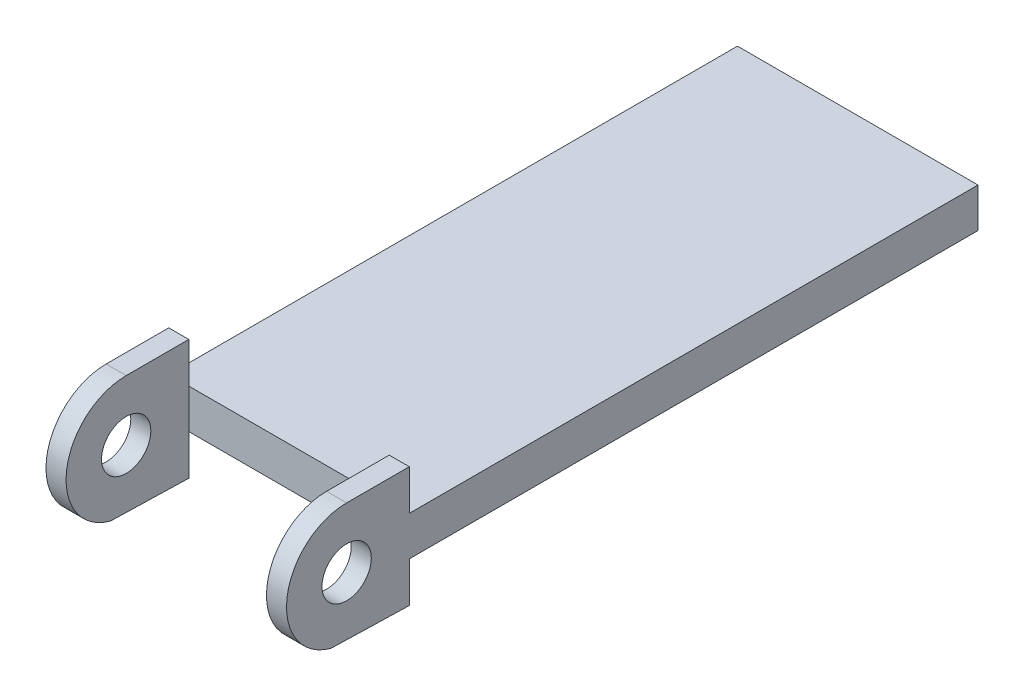
ISO-10303-21;
HEADER;
FILE_DESCRIPTION(('STEP AP214'),'2;1');
FILE_NAME('part.step','',(''),(''),'','','');
FILE_SCHEMA(('AUTOMOTIVE_DESIGN { 1 0 10303 214 1 1 1 1 }'));
ENDSEC;
DATA;
#1=APPLICATION_CONTEXT('core data for automotive mechanical design processes');
#2=APPLICATION_PROTOCOL_DEFINITION('international standard','automotive_design',2000,#1);
#3=PRODUCT_CONTEXT('',#1,'mechanical');
#4=PRODUCT('Part','Part','',(#3));
#5=PRODUCT_RELATED_PRODUCT_CATEGORY('part','',(#4));
#6=PRODUCT_DEFINITION_FORMATION('','',#4);
#7=PRODUCT_DEFINITION_CONTEXT('part definition',#1,'design');
#8=PRODUCT_DEFINITION('design','',#6,#7);
#9=PRODUCT_DEFINITION_SHAPE('','',#8);
#10=(LENGTH_UNIT() NAMED_UNIT(*) SI_UNIT(.MILLI.,.METRE.));
#11=(NAMED_UNIT(*) PLANE_ANGLE_UNIT() SI_UNIT($,.RADIAN.));
#12=(NAMED_UNIT(*) SI_UNIT($,.STERADIAN.) SOLID_ANGLE_UNIT());
#13=UNCERTAINTY_MEASURE_WITH_UNIT(LENGTH_MEASURE(1.E-05),#10,'distance_accuracy_value','');
#14=(GEOMETRIC_REPRESENTATION_CONTEXT(3) GLOBAL_UNCERTAINTY_ASSIGNED_CONTEXT((#13)) GLOBAL_UNIT_ASSIGNED_CONTEXT((#10,
#11,#12)) REPRESENTATION_CONTEXT('',''));
#15=CARTESIAN_POINT('',(0.,0.,0.));
#16=DIRECTION('',(0.,0.,1.));
#17=DIRECTION('',(1.,0.,0.));
#18=AXIS2_PLACEMENT_3D('',#15,#16,#17);
#19=CARTESIAN_POINT('',(-14.8073113249384,0.,13.462));
#20=DIRECTION('',(0.,0.,1.));
#21=DIRECTION('',(1.,0.,0.));
#22=AXIS2_PLACEMENT_3D('',#19,#20,#21);
#23=PLANE('',#22);
#24=DIRECTION('',(1.,0.,0.));
#25=VECTOR('',#24,1.);
#26=CARTESIAN_POINT('',(-14.8073113249384,-2.048,13.462));
#27=LINE('',#26,#25);
#28=CARTESIAN_POINT('',(5.08,-2.048,13.462));
#29=VERTEX_POINT('',#28);
#30=CARTESIAN_POINT('',(6.096,-2.048,13.462));
#31=VERTEX_POINT('',#30);
#32=EDGE_CURVE('E247',#29,#31,#27,.T.);
#33=ORIENTED_EDGE('',*,*,#32,.F.);
#34=DIRECTION('',(0.,1.,0.));
#35=VECTOR('',#34,1.);
#36=CARTESIAN_POINT('',(5.08,-2.048,13.462));
#37=LINE('',#36,#35);
#38=CARTESIAN_POINT('',(5.08,0.,13.462));
#39=VERTEX_POINT('',#38);
#40=EDGE_CURVE('E106',#29,#39,#37,.T.);
#41=ORIENTED_EDGE('',*,*,#40,.T.);
#42=DIRECTION('',(1.,0.,0.));
#43=VECTOR('',#42,1.);
#44=CARTESIAN_POINT('',(0.,0.,13.462));
#45=LINE('',#44,#43);
#46=CARTESIAN_POINT('',(6.096,0.,13.462));
#47=VERTEX_POINT('',#46);
#48=EDGE_CURVE('E44',#39,#47,#45,.T.);
#49=ORIENTED_EDGE('',*,*,#48,.T.);
#50=DIRECTION('',(0.,-1.,0.));
#51=VECTOR('',#50,1.);
#52=CARTESIAN_POINT('',(6.096,0.,13.462));
#53=LINE('',#52,#51);
#54=EDGE_CURVE('E190',#47,#31,#53,.T.);
#55=ORIENTED_EDGE('',*,*,#54,.T.);
#56=EDGE_LOOP('',(#33,#41,#49,#55));
#57=FACE_BOUND('',#56,.T.);
#58=ADVANCED_FACE('F35',(#57),#23,.F.);
#59=CARTESIAN_POINT('',(-14.8073113249384,1.,16.637));
#60=DIRECTION('',(1.,0.,0.));
#61=DIRECTION('',(0.,0.,-1.));
#62=AXIS2_PLACEMENT_3D('',#59,#60,#61);
#63=CYLINDRICAL_SURFACE('',#62,3.048);
#64=CARTESIAN_POINT('',(5.08,1.,16.637));
#65=DIRECTION('',(1.,0.,0.));
#66=DIRECTION('',(0.,0.,-1.));
#67=AXIS2_PLACEMENT_3D('',#64,#65,#66);
#68=CIRCLE('',#67,3.048);
#69=CARTESIAN_POINT('',(5.08,-1.94162891416641,17.4352000572163));
#70=VERTEX_POINT('',#69);
#71=CARTESIAN_POINT('',(5.08,4.048,16.637));
#72=VERTEX_POINT('',#71);
#73=EDGE_CURVE('E279',#70,#72,#68,.F.);
#74=ORIENTED_EDGE('',*,*,#73,.F.);
#75=DIRECTION('',(1.,0.,0.));
#76=VECTOR('',#75,1.);
#77=CARTESIAN_POINT('',(-14.8073113249384,-1.94162891416641,17.4352000572163));
#78=LINE('',#77,#76);
#79=CARTESIAN_POINT('',(6.096,-1.94162891416641,17.4352000572163));
#80=VERTEX_POINT('',#79);
#81=EDGE_CURVE('E171',#70,#80,#78,.T.);
#82=ORIENTED_EDGE('',*,*,#81,.T.);
#83=CARTESIAN_POINT('',(6.096,1.,16.637));
#84=DIRECTION('',(1.,0.,0.));
#85=DIRECTION('',(0.,0.,-1.));
#86=AXIS2_PLACEMENT_3D('',#83,#84,#85);
#87=CIRCLE('',#86,3.048);
#88=CARTESIAN_POINT('',(6.096,4.048,16.637));
#89=VERTEX_POINT('',#88);
#90=EDGE_CURVE('E256',#89,#80,#87,.T.);
#91=ORIENTED_EDGE('',*,*,#90,.F.);
#92=DIRECTION('',(1.,0.,0.));
#93=VECTOR('',#92,1.);
#94=CARTESIAN_POINT('',(-14.8073113249384,4.048,16.637));
#95=LINE('',#94,#93);
#96=EDGE_CURVE('E172',#72,#89,#95,.T.);
#97=ORIENTED_EDGE('',*,*,#96,.F.);
#98=EDGE_LOOP('',(#74,#82,#91,#97));
#99=FACE_BOUND('',#98,.T.);
#100=ADVANCED_FACE('F305',(#99),#63,.T.);
#101=CARTESIAN_POINT('',(-14.8073113249384,-2.40668162493172,0.0644320280915053));
#102=DIRECTION('',(0.,0.999641818673696,-0.0267625551610102));
#103=DIRECTION('',(0.,0.0267625551610102,0.999641818673696));
#104=AXIS2_PLACEMENT_3D('',#101,#102,#103);
#105=PLANE('',#104);
#106=ORIENTED_EDGE('',*,*,#81,.F.);
#107=DIRECTION('',(0.,-0.0267625551610102,-0.999641818673696));
#108=VECTOR('',#107,1.);
#109=CARTESIAN_POINT('',(5.08,-2.40668162493172,0.0644320280915053));
#110=LINE('',#109,#108);
#111=EDGE_CURVE('E281',#70,#29,#110,.T.);
#112=ORIENTED_EDGE('',*,*,#111,.T.);
#113=ORIENTED_EDGE('',*,*,#32,.T.);
#114=DIRECTION('',(0.,0.0267625551610102,0.999641818673696));
#115=VECTOR('',#114,1.);
#116=CARTESIAN_POINT('',(6.096,-2.40668162493172,0.0644320280915025));
#117=LINE('',#116,#115);
#118=EDGE_CURVE('E253',#31,#80,#117,.T.);
#119=ORIENTED_EDGE('',*,*,#118,.T.);
#120=EDGE_LOOP('',(#106,#112,#113,#119));
#121=FACE_BOUND('',#120,.T.);
#122=ADVANCED_FACE('F312',(#121),#105,.F.);
#123=DIRECTION('',(1.,0.,0.));
#124=VECTOR('',#123,1.);
#125=CARTESIAN_POINT('',(0.,2.,13.462));
#126=LINE('',#125,#124);
#127=CARTESIAN_POINT('',(5.08,2.,13.462));
#128=VERTEX_POINT('',#127);
#129=CARTESIAN_POINT('',(6.096,2.,13.462));
#130=VERTEX_POINT('',#129);
#131=EDGE_CURVE('E182',#128,#130,#126,.T.);
#132=ORIENTED_EDGE('',*,*,#131,.F.);
#133=CARTESIAN_POINT('',(5.08,4.048,13.462));
#134=VERTEX_POINT('',#133);
#135=EDGE_CURVE('E115',#128,#134,#37,.T.);
#136=ORIENTED_EDGE('',*,*,#135,.T.);
#137=DIRECTION('',(1.,0.,0.));
#138=VECTOR('',#137,1.);
#139=CARTESIAN_POINT('',(-14.8073113249384,4.048,13.462));
#140=LINE('',#139,#138);
#141=CARTESIAN_POINT('',(6.096,4.048,13.462));
#142=VERTEX_POINT('',#141);
#143=EDGE_CURVE('E246',#134,#142,#140,.T.);
#144=ORIENTED_EDGE('',*,*,#143,.T.);
#145=EDGE_CURVE('E177',#142,#130,#53,.T.);
#146=ORIENTED_EDGE('',*,*,#145,.T.);
#147=EDGE_LOOP('',(#132,#136,#144,#146));
#148=FACE_BOUND('',#147,.T.);
#149=ADVANCED_FACE('F307',(#148),#23,.F.);
#150=CARTESIAN_POINT('',(-14.8073113249384,4.04799999999999,0.));
#151=DIRECTION('',(0.,-1.,0.));
#152=DIRECTION('',(0.,0.,-1.));
#153=AXIS2_PLACEMENT_3D('',#150,#151,#152);
#154=PLANE('',#153);
#155=ORIENTED_EDGE('',*,*,#143,.F.);
#156=DIRECTION('',(0.,0.,-1.));
#157=VECTOR('',#156,1.);
#158=CARTESIAN_POINT('',(5.08,4.048,19.685));
#159=LINE('',#158,#157);
#160=EDGE_CURVE('E138',#72,#134,#159,.T.);
#161=ORIENTED_EDGE('',*,*,#160,.F.);
#162=ORIENTED_EDGE('',*,*,#96,.T.);
#163=DIRECTION('',(0.,0.,-1.));
#164=VECTOR('',#163,1.);
#165=CARTESIAN_POINT('',(6.096,4.04799999999999,0.));
#166=LINE('',#165,#164);
#167=EDGE_CURVE('E259',#89,#142,#166,.T.);
#168=ORIENTED_EDGE('',*,*,#167,.T.);
#169=EDGE_LOOP('',(#155,#161,#162,#168));
#170=FACE_BOUND('',#169,.T.);
#171=ADVANCED_FACE('F318',(#170),#154,.F.);
#172=CARTESIAN_POINT('',(-6.096,1.,16.637));
#173=DIRECTION('',(1.,0.,0.));
#174=DIRECTION('',(0.,0.,-1.));
#175=AXIS2_PLACEMENT_3D('',#172,#173,#174);
#176=CYLINDRICAL_SURFACE('',#175,1.25);
#177=CARTESIAN_POINT('',(5.08,1.,16.637));
#178=DIRECTION('',(1.,0.,0.));
#179=DIRECTION('',(0.,0.,-1.));
#180=AXIS2_PLACEMENT_3D('',#177,#178,#179);
#181=CIRCLE('',#180,1.25);
#182=CARTESIAN_POINT('',(5.08,1.,15.387));
#183=VERTEX_POINT('',#182);
#184=EDGE_CURVE('E39',#183,#183,#181,.F.);
#185=ORIENTED_EDGE('',*,*,#184,.T.);
#186=EDGE_LOOP('',(#185));
#187=FACE_BOUND('',#186,.T.);
#188=CARTESIAN_POINT('',(6.096,1.,16.637));
#189=DIRECTION('',(1.,0.,0.));
#190=DIRECTION('',(0.,0.,-1.));
#191=AXIS2_PLACEMENT_3D('',#188,#189,#190);
#192=CIRCLE('',#191,1.25);
#193=CARTESIAN_POINT('',(6.096,1.,15.387));
#194=VERTEX_POINT('',#193);
#195=EDGE_CURVE('E270',#194,#194,#192,.T.);
#196=ORIENTED_EDGE('',*,*,#195,.T.);
#197=EDGE_LOOP('',(#196));
#198=FACE_BOUND('',#197,.T.);
#199=ADVANCED_FACE('F289',(#187,#198),#176,.F.);
#200=CARTESIAN_POINT('',(0.,2.,0.));
#201=DIRECTION('',(0.,1.,0.));
#202=DIRECTION('',(0.,0.,1.));
#203=AXIS2_PLACEMENT_3D('',#200,#201,#202);
#204=PLANE('',#203);
#205=DIRECTION('',(0.,0.,1.));
#206=VECTOR('',#205,1.);
#207=CARTESIAN_POINT('',(-6.096,2.,-15.367));
#208=LINE('',#207,#206);
#209=CARTESIAN_POINT('',(-6.096,2.,-15.367));
#210=VERTEX_POINT('',#209);
#211=CARTESIAN_POINT('',(-6.096,2.,13.462));
#212=VERTEX_POINT('',#211);
#213=EDGE_CURVE('E93',#210,#212,#208,.T.);
#214=ORIENTED_EDGE('',*,*,#213,.T.);
#215=CARTESIAN_POINT('',(-5.08,2.,13.462));
#216=VERTEX_POINT('',#215);
#217=EDGE_CURVE('E180',#212,#216,#126,.T.);
#218=ORIENTED_EDGE('',*,*,#217,.T.);
#219=DIRECTION('',(-1.,0.,0.));
#220=VECTOR('',#219,1.);
#221=CARTESIAN_POINT('',(0.,2.,13.462));
#222=LINE('',#221,#220);
#223=EDGE_CURVE('E273',#128,#216,#222,.T.);
#224=ORIENTED_EDGE('',*,*,#223,.F.);
#225=ORIENTED_EDGE('',*,*,#131,.T.);
#226=DIRECTION('',(0.,0.,-1.));
#227=VECTOR('',#226,1.);
#228=CARTESIAN_POINT('',(6.096,2.,-15.367));
#229=LINE('',#228,#227);
#230=CARTESIAN_POINT('',(6.096,2.,-15.367));
#231=VERTEX_POINT('',#230);
#232=EDGE_CURVE('E98',#130,#231,#229,.T.);
#233=ORIENTED_EDGE('',*,*,#232,.T.);
#234=DIRECTION('',(-1.,0.,0.));
#235=VECTOR('',#234,1.);
#236=CARTESIAN_POINT('',(-6.096,2.,-15.367));
#237=LINE('',#236,#235);
#238=EDGE_CURVE('E61',#231,#210,#237,.T.);
#239=ORIENTED_EDGE('',*,*,#238,.T.);
#240=EDGE_LOOP('',(#214,#218,#224,#225,#233,#239));
#241=FACE_BOUND('',#240,.T.);
#242=ADVANCED_FACE('F339',(#241),#204,.T.);
#243=CARTESIAN_POINT('',(0.,0.,0.));
#244=DIRECTION('',(0.,1.,0.));
#245=DIRECTION('',(0.,0.,1.));
#246=AXIS2_PLACEMENT_3D('',#243,#244,#245);
#247=PLANE('',#246);
#248=CARTESIAN_POINT('',(-6.096,0.,13.462));
#249=VERTEX_POINT('',#248);
#250=CARTESIAN_POINT('',(-5.08,0.,13.462));
#251=VERTEX_POINT('',#250);
#252=EDGE_CURVE('E11',#249,#251,#45,.T.);
#253=ORIENTED_EDGE('',*,*,#252,.F.);
#254=DIRECTION('',(0.,0.,1.));
#255=VECTOR('',#254,1.);
#256=CARTESIAN_POINT('',(-6.096,0.,-15.367));
#257=LINE('',#256,#255);
#258=CARTESIAN_POINT('',(-6.096,0.,-15.367));
#259=VERTEX_POINT('',#258);
#260=EDGE_CURVE('E84',#259,#249,#257,.T.);
#261=ORIENTED_EDGE('',*,*,#260,.F.);
#262=DIRECTION('',(-1.,0.,0.));
#263=VECTOR('',#262,1.);
#264=CARTESIAN_POINT('',(-6.096,0.,-15.367));
#265=LINE('',#264,#263);
#266=CARTESIAN_POINT('',(6.096,0.,-15.367));
#267=VERTEX_POINT('',#266);
#268=EDGE_CURVE('E74',#267,#259,#265,.T.);
#269=ORIENTED_EDGE('',*,*,#268,.F.);
#270=DIRECTION('',(0.,0.,-1.));
#271=VECTOR('',#270,1.);
#272=CARTESIAN_POINT('',(6.096,0.,-15.367));
#273=LINE('',#272,#271);
#274=EDGE_CURVE('E85',#47,#267,#273,.T.);
#275=ORIENTED_EDGE('',*,*,#274,.F.);
#276=ORIENTED_EDGE('',*,*,#48,.F.);
#277=DIRECTION('',(-1.,0.,0.));
#278=VECTOR('',#277,1.);
#279=CARTESIAN_POINT('',(0.,0.,13.462));
#280=LINE('',#279,#278);
#281=EDGE_CURVE('E277',#39,#251,#280,.T.);
#282=ORIENTED_EDGE('',*,*,#281,.T.);
#283=EDGE_LOOP('',(#253,#261,#269,#275,#276,#282));
#284=FACE_BOUND('',#283,.T.);
#285=ADVANCED_FACE('F96',(#284),#247,.F.);
#286=CARTESIAN_POINT('',(6.096,2.,-15.367));
#287=DIRECTION('',(-1.,0.,0.));
#288=DIRECTION('',(0.,0.,1.));
#289=AXIS2_PLACEMENT_3D('',#286,#287,#288);
#290=PLANE('',#289);
#291=ORIENTED_EDGE('',*,*,#195,.F.);
#292=EDGE_LOOP('',(#291));
#293=FACE_BOUND('',#292,.T.);
#294=ORIENTED_EDGE('',*,*,#54,.F.);
#295=ORIENTED_EDGE('',*,*,#274,.T.);
#296=DIRECTION('',(0.,-1.,0.));
#297=VECTOR('',#296,1.);
#298=CARTESIAN_POINT('',(6.096,2.,-15.367));
#299=LINE('',#298,#297);
#300=EDGE_CURVE('E80',#231,#267,#299,.T.);
#301=ORIENTED_EDGE('',*,*,#300,.F.);
#302=ORIENTED_EDGE('',*,*,#232,.F.);
#303=ORIENTED_EDGE('',*,*,#145,.F.);
#304=ORIENTED_EDGE('',*,*,#167,.F.);
#305=ORIENTED_EDGE('',*,*,#90,.T.);
#306=ORIENTED_EDGE('',*,*,#118,.F.);
#307=EDGE_LOOP('',(#294,#295,#301,#302,#303,#304,#305,#306));
#308=FACE_BOUND('',#307,.T.);
#309=ADVANCED_FACE('F37',(#293,#308),#290,.F.);
#310=CARTESIAN_POINT('',(-6.096,2.,-15.367));
#311=DIRECTION('',(0.,0.,1.));
#312=DIRECTION('',(1.,0.,0.));
#313=AXIS2_PLACEMENT_3D('',#310,#311,#312);
#314=PLANE('',#313);
#315=ORIENTED_EDGE('',*,*,#268,.T.);
#316=DIRECTION('',(0.,-1.,0.));
#317=VECTOR('',#316,1.);
#318=CARTESIAN_POINT('',(-6.096,2.,-15.367));
#319=LINE('',#318,#317);
#320=EDGE_CURVE('E77',#210,#259,#319,.T.);
#321=ORIENTED_EDGE('',*,*,#320,.F.);
#322=ORIENTED_EDGE('',*,*,#238,.F.);
#323=ORIENTED_EDGE('',*,*,#300,.T.);
#324=EDGE_LOOP('',(#315,#321,#322,#323));
#325=FACE_BOUND('',#324,.T.);
#326=ADVANCED_FACE('F76',(#325),#314,.F.);
#327=CARTESIAN_POINT('',(-6.096,2.,-15.367));
#328=DIRECTION('',(1.,0.,0.));
#329=DIRECTION('',(0.,0.,-1.));
#330=AXIS2_PLACEMENT_3D('',#327,#328,#329);
#331=PLANE('',#330);
#332=CARTESIAN_POINT('',(-6.096,1.,16.637));
#333=DIRECTION('',(1.,0.,0.));
#334=DIRECTION('',(0.,0.,-1.));
#335=AXIS2_PLACEMENT_3D('',#332,#333,#334);
#336=CIRCLE('',#335,1.25);
#337=CARTESIAN_POINT('',(-6.096,1.,15.387));
#338=VERTEX_POINT('',#337);
#339=EDGE_CURVE('E262',#338,#338,#336,.T.);
#340=ORIENTED_EDGE('',*,*,#339,.T.);
#341=EDGE_LOOP('',(#340));
#342=FACE_BOUND('',#341,.T.);
#343=DIRECTION('',(0.,1.,0.));
#344=VECTOR('',#343,1.);
#345=CARTESIAN_POINT('',(-6.096,0.,13.462));
#346=LINE('',#345,#344);
#347=CARTESIAN_POINT('',(-6.096,4.048,13.462));
#348=VERTEX_POINT('',#347);
#349=EDGE_CURVE('E267',#212,#348,#346,.T.);
#350=ORIENTED_EDGE('',*,*,#349,.F.);
#351=ORIENTED_EDGE('',*,*,#213,.F.);
#352=ORIENTED_EDGE('',*,*,#320,.T.);
#353=ORIENTED_EDGE('',*,*,#260,.T.);
#354=CARTESIAN_POINT('',(-6.096,-2.048,13.462));
#355=VERTEX_POINT('',#354);
#356=EDGE_CURVE('E265',#355,#249,#346,.T.);
#357=ORIENTED_EDGE('',*,*,#356,.F.);
#358=DIRECTION('',(0.,-0.0267625551610102,-0.999641818673696));
#359=VECTOR('',#358,1.);
#360=CARTESIAN_POINT('',(-6.096,-2.40668162493172,0.0644320280915043));
#361=LINE('',#360,#359);
#362=CARTESIAN_POINT('',(-6.096,-1.94162891416641,17.4352000572163));
#363=VERTEX_POINT('',#362);
#364=EDGE_CURVE('E245',#363,#355,#361,.T.);
#365=ORIENTED_EDGE('',*,*,#364,.F.);
#366=CARTESIAN_POINT('',(-6.096,1.,16.637));
#367=DIRECTION('',(1.,0.,0.));
#368=DIRECTION('',(0.,0.,-1.));
#369=AXIS2_PLACEMENT_3D('',#366,#367,#368);
#370=CIRCLE('',#369,3.048);
#371=CARTESIAN_POINT('',(-6.096,4.048,16.637));
#372=VERTEX_POINT('',#371);
#373=EDGE_CURVE('E264',#363,#372,#370,.F.);
#374=ORIENTED_EDGE('',*,*,#373,.T.);
#375=DIRECTION('',(0.,0.,1.));
#376=VECTOR('',#375,1.);
#377=CARTESIAN_POINT('',(-6.096,4.04799999999999,0.));
#378=LINE('',#377,#376);
#379=EDGE_CURVE('E170',#348,#372,#378,.T.);
#380=ORIENTED_EDGE('',*,*,#379,.F.);
#381=EDGE_LOOP('',(#350,#351,#352,#353,#357,#365,#374,#380));
#382=FACE_BOUND('',#381,.T.);
#383=ADVANCED_FACE('F90',(#342,#382),#331,.F.);
#384=ORIENTED_EDGE('',*,*,#252,.T.);
#385=DIRECTION('',(0.,1.,0.));
#386=VECTOR('',#385,1.);
#387=CARTESIAN_POINT('',(-5.08,-2.048,13.462));
#388=LINE('',#387,#386);
#389=CARTESIAN_POINT('',(-5.08,-2.048,13.462));
#390=VERTEX_POINT('',#389);
#391=EDGE_CURVE('E126',#390,#251,#388,.T.);
#392=ORIENTED_EDGE('',*,*,#391,.F.);
#393=EDGE_CURVE('E242',#355,#390,#27,.T.);
#394=ORIENTED_EDGE('',*,*,#393,.F.);
#395=ORIENTED_EDGE('',*,*,#356,.T.);
#396=EDGE_LOOP('',(#384,#392,#394,#395));
#397=FACE_BOUND('',#396,.T.);
#398=ADVANCED_FACE('F241',(#397),#23,.F.);
#399=CARTESIAN_POINT('',(-5.08,-1.94162891416641,17.4352000572163));
#400=VERTEX_POINT('',#399);
#401=EDGE_CURVE('E165',#363,#400,#78,.T.);
#402=ORIENTED_EDGE('',*,*,#401,.T.);
#403=CARTESIAN_POINT('',(-5.08,1.,16.637));
#404=DIRECTION('',(-1.,0.,0.));
#405=DIRECTION('',(0.,0.,1.));
#406=AXIS2_PLACEMENT_3D('',#403,#404,#405);
#407=CIRCLE('',#406,3.048);
#408=CARTESIAN_POINT('',(-5.08,4.048,16.637));
#409=VERTEX_POINT('',#408);
#410=EDGE_CURVE('E110',#409,#400,#407,.F.);
#411=ORIENTED_EDGE('',*,*,#410,.F.);
#412=EDGE_CURVE('E163',#372,#409,#95,.T.);
#413=ORIENTED_EDGE('',*,*,#412,.F.);
#414=ORIENTED_EDGE('',*,*,#373,.F.);
#415=EDGE_LOOP('',(#402,#411,#413,#414));
#416=FACE_BOUND('',#415,.T.);
#417=ADVANCED_FACE('F160',(#416),#63,.T.);
#418=ORIENTED_EDGE('',*,*,#393,.T.);
#419=DIRECTION('',(0.,0.0267625551610102,0.999641818673696));
#420=VECTOR('',#419,1.);
#421=CARTESIAN_POINT('',(-5.08,-2.40668162493172,0.0644320280915039));
#422=LINE('',#421,#420);
#423=EDGE_CURVE('E105',#390,#400,#422,.T.);
#424=ORIENTED_EDGE('',*,*,#423,.T.);
#425=ORIENTED_EDGE('',*,*,#401,.F.);
#426=ORIENTED_EDGE('',*,*,#364,.T.);
#427=EDGE_LOOP('',(#418,#424,#425,#426));
#428=FACE_BOUND('',#427,.T.);
#429=ADVANCED_FACE('F244',(#428),#105,.F.);
#430=CARTESIAN_POINT('',(-5.08,4.048,13.462));
#431=VERTEX_POINT('',#430);
#432=EDGE_CURVE('E248',#348,#431,#140,.T.);
#433=ORIENTED_EDGE('',*,*,#432,.T.);
#434=EDGE_CURVE('E52',#216,#431,#388,.T.);
#435=ORIENTED_EDGE('',*,*,#434,.F.);
#436=ORIENTED_EDGE('',*,*,#217,.F.);
#437=ORIENTED_EDGE('',*,*,#349,.T.);
#438=EDGE_LOOP('',(#433,#435,#436,#437));
#439=FACE_BOUND('',#438,.T.);
#440=ADVANCED_FACE('F308',(#439),#23,.F.);
#441=ORIENTED_EDGE('',*,*,#412,.T.);
#442=DIRECTION('',(0.,0.,1.));
#443=VECTOR('',#442,1.);
#444=CARTESIAN_POINT('',(-5.08,4.048,13.462));
#445=LINE('',#444,#443);
#446=EDGE_CURVE('E140',#431,#409,#445,.T.);
#447=ORIENTED_EDGE('',*,*,#446,.F.);
#448=ORIENTED_EDGE('',*,*,#432,.F.);
#449=ORIENTED_EDGE('',*,*,#379,.T.);
#450=EDGE_LOOP('',(#441,#447,#448,#449));
#451=FACE_BOUND('',#450,.T.);
#452=ADVANCED_FACE('F168',(#451),#154,.F.);
#453=CARTESIAN_POINT('',(-5.08,1.,16.637));
#454=DIRECTION('',(-1.,0.,0.));
#455=DIRECTION('',(0.,0.,1.));
#456=AXIS2_PLACEMENT_3D('',#453,#454,#455);
#457=CIRCLE('',#456,1.25);
#458=CARTESIAN_POINT('',(-5.08,1.,17.887));
#459=VERTEX_POINT('',#458);
#460=EDGE_CURVE('E103',#459,#459,#457,.F.);
#461=ORIENTED_EDGE('',*,*,#460,.T.);
#462=EDGE_LOOP('',(#461));
#463=FACE_BOUND('',#462,.T.);
#464=ORIENTED_EDGE('',*,*,#339,.F.);
#465=EDGE_LOOP('',(#464));
#466=FACE_BOUND('',#465,.T.);
#467=ADVANCED_FACE('F301',(#463,#466),#176,.F.);
#468=CARTESIAN_POINT('',(5.08,-2.048,13.462));
#469=DIRECTION('',(0.,0.,-1.));
#470=DIRECTION('',(-1.,0.,0.));
#471=AXIS2_PLACEMENT_3D('',#468,#469,#470);
#472=PLANE('',#471);
#473=ORIENTED_EDGE('',*,*,#223,.T.);
#474=EDGE_CURVE('E134',#251,#216,#388,.T.);
#475=ORIENTED_EDGE('',*,*,#474,.F.);
#476=ORIENTED_EDGE('',*,*,#281,.F.);
#477=EDGE_CURVE('E113',#39,#128,#37,.T.);
#478=ORIENTED_EDGE('',*,*,#477,.T.);
#479=EDGE_LOOP('',(#473,#475,#476,#478));
#480=FACE_BOUND('',#479,.T.);
#481=ADVANCED_FACE('F294',(#480),#472,.F.);
#482=CARTESIAN_POINT('',(5.08,-2.048,19.685));
#483=DIRECTION('',(1.,0.,0.));
#484=DIRECTION('',(0.,0.,-1.));
#485=AXIS2_PLACEMENT_3D('',#482,#483,#484);
#486=PLANE('',#485);
#487=ORIENTED_EDGE('',*,*,#73,.T.);
#488=ORIENTED_EDGE('',*,*,#160,.T.);
#489=ORIENTED_EDGE('',*,*,#135,.F.);
#490=ORIENTED_EDGE('',*,*,#477,.F.);
#491=ORIENTED_EDGE('',*,*,#40,.F.);
#492=ORIENTED_EDGE('',*,*,#111,.F.);
#493=EDGE_LOOP('',(#487,#488,#489,#490,#491,#492));
#494=FACE_BOUND('',#493,.T.);
#495=ORIENTED_EDGE('',*,*,#184,.F.);
#496=EDGE_LOOP('',(#495));
#497=FACE_BOUND('',#496,.T.);
#498=ADVANCED_FACE('F292',(#494,#497),#486,.F.);
#499=CARTESIAN_POINT('',(-5.08,-2.048,13.462));
#500=DIRECTION('',(-1.,0.,0.));
#501=DIRECTION('',(0.,0.,1.));
#502=AXIS2_PLACEMENT_3D('',#499,#500,#501);
#503=PLANE('',#502);
#504=ORIENTED_EDGE('',*,*,#410,.T.);
#505=ORIENTED_EDGE('',*,*,#423,.F.);
#506=ORIENTED_EDGE('',*,*,#391,.T.);
#507=ORIENTED_EDGE('',*,*,#474,.T.);
#508=ORIENTED_EDGE('',*,*,#434,.T.);
#509=ORIENTED_EDGE('',*,*,#446,.T.);
#510=EDGE_LOOP('',(#504,#505,#506,#507,#508,#509));
#511=FACE_BOUND('',#510,.T.);
#512=ORIENTED_EDGE('',*,*,#460,.F.);
#513=EDGE_LOOP('',(#512));
#514=FACE_BOUND('',#513,.T.);
#515=ADVANCED_FACE('F148',(#511,#514),#503,.F.);
#516=CLOSED_SHELL('',(#58,#100,#122,#149,#171,#199,#242,#285,#309,#326,#383,#398,#417,#429,#440,
#452,#467,#481,#498,#515));
#517=MANIFOLD_SOLID_BREP('B2',#516);
#518=ADVANCED_BREP_SHAPE_REPRESENTATION('',(#18,#517),#14);
#519=SHAPE_DEFINITION_REPRESENTATION(#9,#518);
ENDSEC;
END-ISO-10303-21;
